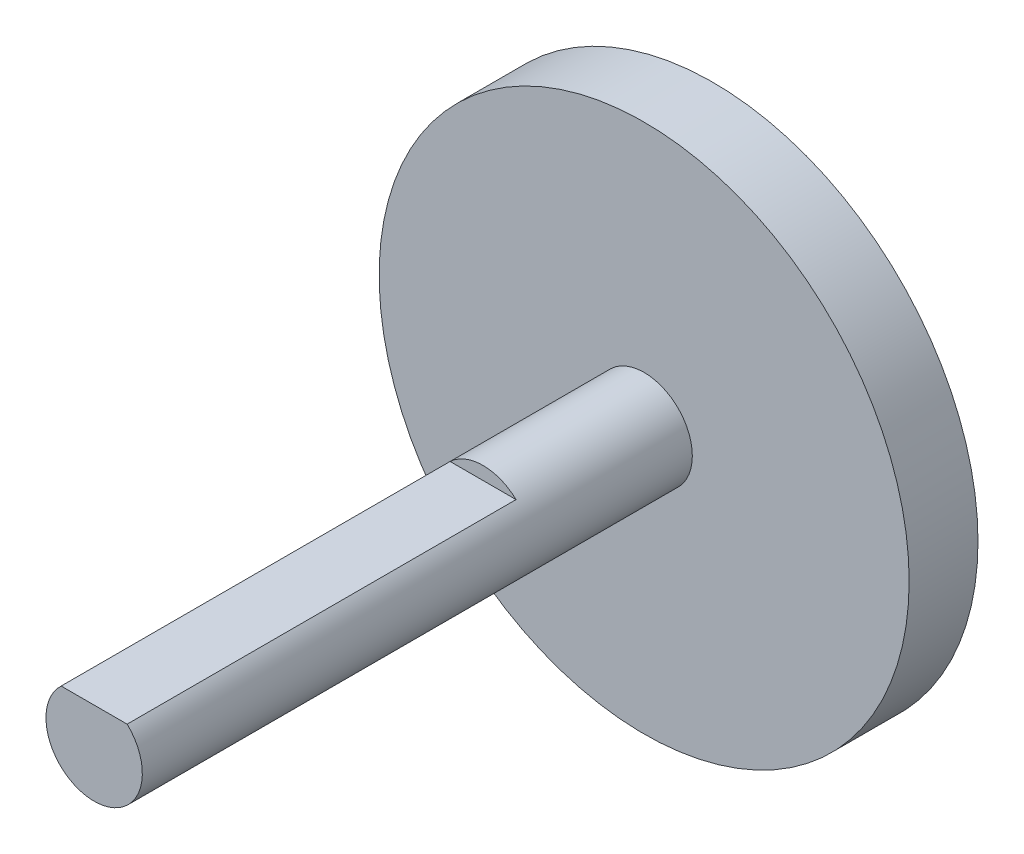
ISO-10303-21;
HEADER;
FILE_DESCRIPTION(('STEP AP214'),'2;1');
FILE_NAME('part.step','',(''),(''),'','','');
FILE_SCHEMA(('AUTOMOTIVE_DESIGN { 1 0 10303 214 1 1 1 1 }'));
ENDSEC;
DATA;
#1=APPLICATION_CONTEXT('core data for automotive mechanical design processes');
#2=APPLICATION_PROTOCOL_DEFINITION('international standard','automotive_design',2000,#1);
#3=PRODUCT_CONTEXT('',#1,'mechanical');
#4=PRODUCT('Part','Part','',(#3));
#5=PRODUCT_RELATED_PRODUCT_CATEGORY('part','',(#4));
#6=PRODUCT_DEFINITION_FORMATION('','',#4);
#7=PRODUCT_DEFINITION_CONTEXT('part definition',#1,'design');
#8=PRODUCT_DEFINITION('design','',#6,#7);
#9=PRODUCT_DEFINITION_SHAPE('','',#8);
#10=(LENGTH_UNIT() NAMED_UNIT(*) SI_UNIT(.MILLI.,.METRE.));
#11=(NAMED_UNIT(*) PLANE_ANGLE_UNIT() SI_UNIT($,.RADIAN.));
#12=(NAMED_UNIT(*) SI_UNIT($,.STERADIAN.) SOLID_ANGLE_UNIT());
#13=UNCERTAINTY_MEASURE_WITH_UNIT(LENGTH_MEASURE(1.E-05),#10,'distance_accuracy_value','');
#14=(GEOMETRIC_REPRESENTATION_CONTEXT(3) GLOBAL_UNCERTAINTY_ASSIGNED_CONTEXT((#13)) GLOBAL_UNIT_ASSIGNED_CONTEXT((#10,
#11,#12)) REPRESENTATION_CONTEXT('',''));
#15=CARTESIAN_POINT('',(0.,0.,0.));
#16=DIRECTION('',(0.,0.,1.));
#17=DIRECTION('',(1.,0.,0.));
#18=AXIS2_PLACEMENT_3D('',#15,#16,#17);
#19=CARTESIAN_POINT('',(0.,0.,5.));
#20=DIRECTION('',(0.,0.,-1.));
#21=DIRECTION('',(-1.,0.,0.));
#22=AXIS2_PLACEMENT_3D('',#19,#20,#21);
#23=CYLINDRICAL_SURFACE('',#22,19.25);
#24=CARTESIAN_POINT('',(0.,0.,5.));
#25=DIRECTION('',(0.,0.,1.));
#26=DIRECTION('',(1.,0.,0.));
#27=AXIS2_PLACEMENT_3D('',#24,#25,#26);
#28=CIRCLE('',#27,19.25);
#29=CARTESIAN_POINT('',(19.25,0.,5.));
#30=VERTEX_POINT('',#29);
#31=EDGE_CURVE('E54',#30,#30,#28,.T.);
#32=ORIENTED_EDGE('',*,*,#31,.F.);
#33=EDGE_LOOP('',(#32));
#34=FACE_BOUND('',#33,.T.);
#35=CARTESIAN_POINT('',(0.,0.,0.));
#36=DIRECTION('',(0.,0.,1.));
#37=DIRECTION('',(1.,0.,0.));
#38=AXIS2_PLACEMENT_3D('',#35,#36,#37);
#39=CIRCLE('',#38,19.25);
#40=CARTESIAN_POINT('',(19.25,0.,0.));
#41=VERTEX_POINT('',#40);
#42=EDGE_CURVE('E48',#41,#41,#39,.T.);
#43=ORIENTED_EDGE('',*,*,#42,.T.);
#44=EDGE_LOOP('',(#43));
#45=FACE_BOUND('',#44,.T.);
#46=ADVANCED_FACE('F45',(#34,#45),#23,.T.);
#47=CARTESIAN_POINT('',(0.,0.,5.));
#48=DIRECTION('',(0.,0.,1.));
#49=DIRECTION('',(1.,0.,0.));
#50=AXIS2_PLACEMENT_3D('',#47,#48,#49);
#51=PLANE('',#50);
#52=CARTESIAN_POINT('',(0.,0.,5.));
#53=DIRECTION('',(0.,0.,1.));
#54=DIRECTION('',(1.,0.,0.));
#55=AXIS2_PLACEMENT_3D('',#52,#53,#54);
#56=CIRCLE('',#55,3.5);
#57=CARTESIAN_POINT('',(3.5,0.,5.));
#58=VERTEX_POINT('',#57);
#59=EDGE_CURVE('E11',#58,#58,#56,.T.);
#60=ORIENTED_EDGE('',*,*,#59,.F.);
#61=EDGE_LOOP('',(#60));
#62=FACE_BOUND('',#61,.T.);
#63=ORIENTED_EDGE('',*,*,#31,.T.);
#64=EDGE_LOOP('',(#63));
#65=FACE_BOUND('',#64,.T.);
#66=ADVANCED_FACE('F108',(#62,#65),#51,.T.);
#67=CARTESIAN_POINT('',(0.,0.,0.));
#68=DIRECTION('',(0.,0.,1.));
#69=DIRECTION('',(1.,0.,0.));
#70=AXIS2_PLACEMENT_3D('',#67,#68,#69);
#71=PLANE('',#70);
#72=ORIENTED_EDGE('',*,*,#42,.F.);
#73=EDGE_LOOP('',(#72));
#74=FACE_BOUND('',#73,.T.);
#75=ADVANCED_FACE('F106',(#74),#71,.F.);
#76=CARTESIAN_POINT('',(0.,0.,16.7));
#77=DIRECTION('',(0.,0.,-1.));
#78=DIRECTION('',(-1.,0.,0.));
#79=AXIS2_PLACEMENT_3D('',#76,#77,#78);
#80=CYLINDRICAL_SURFACE('',#79,3.5);
#81=CARTESIAN_POINT('',(0.,0.,16.7));
#82=DIRECTION('',(0.,0.,1.));
#83=DIRECTION('',(1.,0.,0.));
#84=AXIS2_PLACEMENT_3D('',#81,#82,#83);
#85=CIRCLE('',#84,3.5);
#86=CARTESIAN_POINT('',(2.39739441894737,2.55,16.7));
#87=VERTEX_POINT('',#86);
#88=CARTESIAN_POINT('',(-2.39739441894737,2.55,16.7));
#89=VERTEX_POINT('',#88);
#90=EDGE_CURVE('E73',#87,#89,#85,.T.);
#91=ORIENTED_EDGE('',*,*,#90,.F.);
#92=DIRECTION('',(0.,0.,-1.));
#93=VECTOR('',#92,1.);
#94=CARTESIAN_POINT('',(2.39739441894737,2.55,44.95));
#95=LINE('',#94,#93);
#96=CARTESIAN_POINT('',(2.39739441894737,2.55,44.95));
#97=VERTEX_POINT('',#96);
#98=EDGE_CURVE('E80',#97,#87,#95,.T.);
#99=ORIENTED_EDGE('',*,*,#98,.F.);
#100=CARTESIAN_POINT('',(0.,0.,44.95));
#101=DIRECTION('',(0.,0.,1.));
#102=DIRECTION('',(1.,0.,0.));
#103=AXIS2_PLACEMENT_3D('',#100,#101,#102);
#104=CIRCLE('',#103,3.5);
#105=CARTESIAN_POINT('',(-2.39739441894737,2.55,44.95));
#106=VERTEX_POINT('',#105);
#107=EDGE_CURVE('E87',#106,#97,#104,.T.);
#108=ORIENTED_EDGE('',*,*,#107,.F.);
#109=DIRECTION('',(0.,0.,-1.));
#110=VECTOR('',#109,1.);
#111=CARTESIAN_POINT('',(-2.39739441894737,2.55,44.95));
#112=LINE('',#111,#110);
#113=EDGE_CURVE('E84',#106,#89,#112,.T.);
#114=ORIENTED_EDGE('',*,*,#113,.T.);
#115=EDGE_LOOP('',(#91,#99,#108,#114));
#116=FACE_BOUND('',#115,.T.);
#117=ORIENTED_EDGE('',*,*,#59,.T.);
#118=EDGE_LOOP('',(#117));
#119=FACE_BOUND('',#118,.T.);
#120=ADVANCED_FACE('F89',(#116,#119),#80,.T.);
#121=CARTESIAN_POINT('',(0.,0.,16.7));
#122=DIRECTION('',(0.,0.,1.));
#123=DIRECTION('',(1.,0.,0.));
#124=AXIS2_PLACEMENT_3D('',#121,#122,#123);
#125=PLANE('',#124);
#126=DIRECTION('',(-1.,0.,0.));
#127=VECTOR('',#126,1.);
#128=CARTESIAN_POINT('',(-2.39739441894737,2.55,16.7));
#129=LINE('',#128,#127);
#130=EDGE_CURVE('E61',#87,#89,#129,.T.);
#131=ORIENTED_EDGE('',*,*,#130,.F.);
#132=ORIENTED_EDGE('',*,*,#90,.T.);
#133=EDGE_LOOP('',(#131,#132));
#134=FACE_BOUND('',#133,.T.);
#135=ADVANCED_FACE('F74',(#134),#125,.T.);
#136=CARTESIAN_POINT('',(-2.39739441894737,2.55,44.95));
#137=DIRECTION('',(0.,-1.,0.));
#138=DIRECTION('',(0.,0.,-1.));
#139=AXIS2_PLACEMENT_3D('',#136,#137,#138);
#140=PLANE('',#139);
#141=ORIENTED_EDGE('',*,*,#130,.T.);
#142=ORIENTED_EDGE('',*,*,#113,.F.);
#143=DIRECTION('',(-1.,0.,0.));
#144=VECTOR('',#143,1.);
#145=CARTESIAN_POINT('',(-2.39739441894737,2.55,44.95));
#146=LINE('',#145,#144);
#147=EDGE_CURVE('E69',#97,#106,#146,.T.);
#148=ORIENTED_EDGE('',*,*,#147,.F.);
#149=ORIENTED_EDGE('',*,*,#98,.T.);
#150=EDGE_LOOP('',(#141,#142,#148,#149));
#151=FACE_BOUND('',#150,.T.);
#152=ADVANCED_FACE('F83',(#151),#140,.F.);
#153=CARTESIAN_POINT('',(0.,0.,44.95));
#154=DIRECTION('',(0.,0.,1.));
#155=DIRECTION('',(1.,0.,0.));
#156=AXIS2_PLACEMENT_3D('',#153,#154,#155);
#157=PLANE('',#156);
#158=ORIENTED_EDGE('',*,*,#107,.T.);
#159=ORIENTED_EDGE('',*,*,#147,.T.);
#160=EDGE_LOOP('',(#158,#159));
#161=FACE_BOUND('',#160,.T.);
#162=ADVANCED_FACE('F158',(#161),#157,.T.);
#163=CLOSED_SHELL('',(#46,#66,#75,#120,#135,#152,#162));
#164=MANIFOLD_SOLID_BREP('B2',#163);
#165=ADVANCED_BREP_SHAPE_REPRESENTATION('',(#18,#164),#14);
#166=SHAPE_DEFINITION_REPRESENTATION(#9,#165);
ENDSEC;
END-ISO-10303-21;
